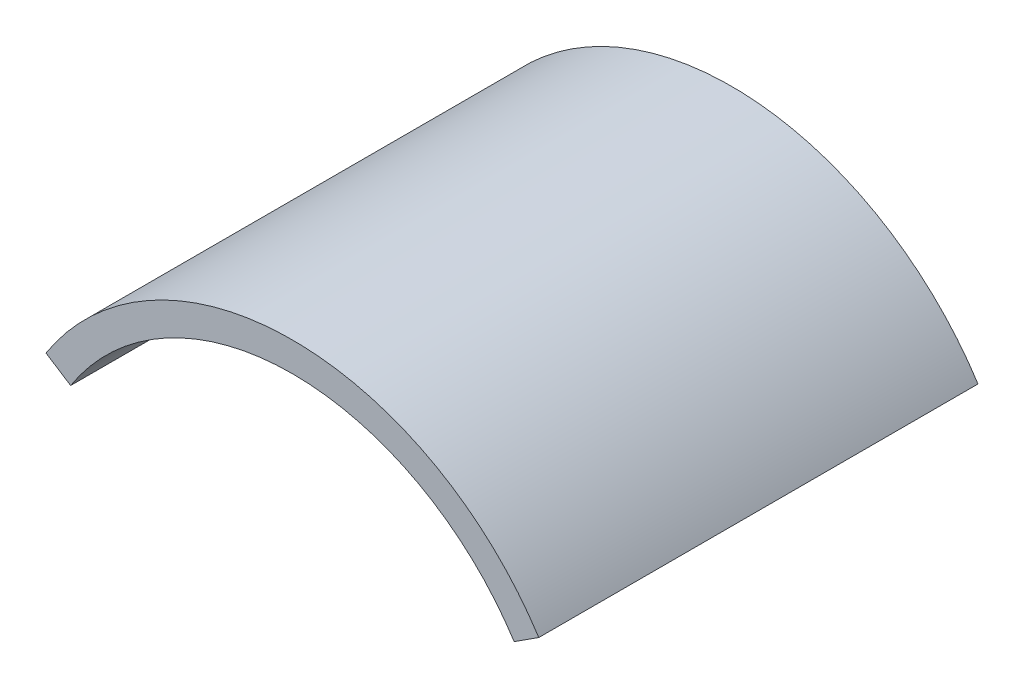
ISO-10303-21;
HEADER;
FILE_DESCRIPTION(('STEP AP214'),'2;1');
FILE_NAME('part.step','',(''),(''),'','','');
FILE_SCHEMA(('AUTOMOTIVE_DESIGN { 1 0 10303 214 1 1 1 1 }'));
ENDSEC;
DATA;
#1=APPLICATION_CONTEXT('core data for automotive mechanical design processes');
#2=APPLICATION_PROTOCOL_DEFINITION('international standard','automotive_design',2000,#1);
#3=PRODUCT_CONTEXT('',#1,'mechanical');
#4=PRODUCT('Part','Part','',(#3));
#5=PRODUCT_RELATED_PRODUCT_CATEGORY('part','',(#4));
#6=PRODUCT_DEFINITION_FORMATION('','',#4);
#7=PRODUCT_DEFINITION_CONTEXT('part definition',#1,'design');
#8=PRODUCT_DEFINITION('design','',#6,#7);
#9=PRODUCT_DEFINITION_SHAPE('','',#8);
#10=(LENGTH_UNIT() NAMED_UNIT(*) SI_UNIT(.MILLI.,.METRE.));
#11=(NAMED_UNIT(*) PLANE_ANGLE_UNIT() SI_UNIT($,.RADIAN.));
#12=(NAMED_UNIT(*) SI_UNIT($,.STERADIAN.) SOLID_ANGLE_UNIT());
#13=UNCERTAINTY_MEASURE_WITH_UNIT(LENGTH_MEASURE(1.E-05),#10,'distance_accuracy_value','');
#14=(GEOMETRIC_REPRESENTATION_CONTEXT(3) GLOBAL_UNCERTAINTY_ASSIGNED_CONTEXT((#13)) GLOBAL_UNIT_ASSIGNED_CONTEXT((#10,
#11,#12)) REPRESENTATION_CONTEXT('',''));
#15=CARTESIAN_POINT('',(0.,0.,0.));
#16=DIRECTION('',(0.,0.,1.));
#17=DIRECTION('',(1.,0.,0.));
#18=AXIS2_PLACEMENT_3D('',#15,#16,#17);
#19=CARTESIAN_POINT('',(0.,0.,0.));
#20=DIRECTION('',(0.,0.,1.));
#21=DIRECTION('',(1.,0.,0.));
#22=AXIS2_PLACEMENT_3D('',#19,#20,#21);
#23=PLANE('',#22);
#24=CARTESIAN_POINT('',(0.,0.,0.));
#25=DIRECTION('',(0.,0.,-1.));
#26=DIRECTION('',(1.,0.,0.));
#27=AXIS2_PLACEMENT_3D('',#24,#25,#26);
#28=CIRCLE('',#27,18.);
#29=CARTESIAN_POINT('',(-15.1463454098294,9.72564757361383,0.));
#30=VERTEX_POINT('',#29);
#31=CARTESIAN_POINT('',(15.1463454098294,9.72564757361383,0.));
#32=VERTEX_POINT('',#31);
#33=EDGE_CURVE('E72',#30,#32,#28,.T.);
#34=ORIENTED_EDGE('',*,*,#33,.T.);
#35=DIRECTION('',(0.84146363387941,0.540313754089657,0.));
#36=VECTOR('',#35,1.);
#37=CARTESIAN_POINT('',(15.1463454098294,9.72564757361383,0.));
#38=LINE('',#37,#36);
#39=CARTESIAN_POINT('',(16.8292726775882,10.8062750817931,0.));
#40=VERTEX_POINT('',#39);
#41=EDGE_CURVE('E67',#32,#40,#38,.T.);
#42=ORIENTED_EDGE('',*,*,#41,.T.);
#43=CARTESIAN_POINT('',(0.,0.,0.));
#44=DIRECTION('',(0.,0.,1.));
#45=DIRECTION('',(1.,0.,0.));
#46=AXIS2_PLACEMENT_3D('',#43,#44,#45);
#47=CIRCLE('',#46,20.);
#48=CARTESIAN_POINT('',(-16.8292726775882,10.8062750817931,0.));
#49=VERTEX_POINT('',#48);
#50=EDGE_CURVE('E84',#40,#49,#47,.T.);
#51=ORIENTED_EDGE('',*,*,#50,.T.);
#52=DIRECTION('',(0.841463633879411,-0.540313754089656,0.));
#53=VECTOR('',#52,1.);
#54=CARTESIAN_POINT('',(-16.8292726775882,10.8062750817931,0.));
#55=LINE('',#54,#53);
#56=EDGE_CURVE('E77',#49,#30,#55,.T.);
#57=ORIENTED_EDGE('',*,*,#56,.T.);
#58=EDGE_LOOP('',(#34,#42,#51,#57));
#59=FACE_BOUND('',#58,.T.);
#60=ADVANCED_FACE('F32',(#59),#23,.T.);
#61=CARTESIAN_POINT('',(0.,0.,-30.));
#62=DIRECTION('',(0.,0.,1.));
#63=DIRECTION('',(1.,0.,0.));
#64=AXIS2_PLACEMENT_3D('',#61,#62,#63);
#65=PLANE('',#64);
#66=CARTESIAN_POINT('',(0.,0.,-30.));
#67=DIRECTION('',(0.,0.,-1.));
#68=DIRECTION('',(1.,0.,0.));
#69=AXIS2_PLACEMENT_3D('',#66,#67,#68);
#70=CIRCLE('',#69,18.);
#71=CARTESIAN_POINT('',(-15.1463454098294,9.72564757361383,-30.));
#72=VERTEX_POINT('',#71);
#73=CARTESIAN_POINT('',(15.1463454098294,9.72564757361383,-30.));
#74=VERTEX_POINT('',#73);
#75=EDGE_CURVE('E46',#72,#74,#70,.T.);
#76=ORIENTED_EDGE('',*,*,#75,.F.);
#77=DIRECTION('',(0.841463633879411,-0.540313754089656,0.));
#78=VECTOR('',#77,1.);
#79=CARTESIAN_POINT('',(-16.8292726775882,10.8062750817931,-30.));
#80=LINE('',#79,#78);
#81=CARTESIAN_POINT('',(-16.8292726775882,10.8062750817931,-30.));
#82=VERTEX_POINT('',#81);
#83=EDGE_CURVE('E55',#82,#72,#80,.T.);
#84=ORIENTED_EDGE('',*,*,#83,.F.);
#85=CARTESIAN_POINT('',(0.,0.,-30.));
#86=DIRECTION('',(0.,0.,1.));
#87=DIRECTION('',(1.,0.,0.));
#88=AXIS2_PLACEMENT_3D('',#85,#86,#87);
#89=CIRCLE('',#88,20.);
#90=CARTESIAN_POINT('',(16.8292726775882,10.8062750817931,-30.));
#91=VERTEX_POINT('',#90);
#92=EDGE_CURVE('E92',#91,#82,#89,.T.);
#93=ORIENTED_EDGE('',*,*,#92,.F.);
#94=DIRECTION('',(0.84146363387941,0.540313754089657,0.));
#95=VECTOR('',#94,1.);
#96=CARTESIAN_POINT('',(15.1463454098294,9.72564757361383,-30.));
#97=LINE('',#96,#95);
#98=EDGE_CURVE('E11',#74,#91,#97,.T.);
#99=ORIENTED_EDGE('',*,*,#98,.F.);
#100=EDGE_LOOP('',(#76,#84,#93,#99));
#101=FACE_BOUND('',#100,.T.);
#102=ADVANCED_FACE('F114',(#101),#65,.F.);
#103=CARTESIAN_POINT('',(0.,0.,0.));
#104=DIRECTION('',(0.,0.,-1.));
#105=DIRECTION('',(-1.,0.,0.));
#106=AXIS2_PLACEMENT_3D('',#103,#104,#105);
#107=CYLINDRICAL_SURFACE('',#106,20.);
#108=DIRECTION('',(0.,0.,-1.));
#109=VECTOR('',#108,1.);
#110=CARTESIAN_POINT('',(-16.8292726775882,10.8062750817931,0.));
#111=LINE('',#110,#109);
#112=EDGE_CURVE('E87',#49,#82,#111,.T.);
#113=ORIENTED_EDGE('',*,*,#112,.F.);
#114=ORIENTED_EDGE('',*,*,#50,.F.);
#115=DIRECTION('',(0.,0.,-1.));
#116=VECTOR('',#115,1.);
#117=CARTESIAN_POINT('',(16.8292726775882,10.8062750817931,0.));
#118=LINE('',#117,#116);
#119=EDGE_CURVE('E86',#40,#91,#118,.T.);
#120=ORIENTED_EDGE('',*,*,#119,.T.);
#121=ORIENTED_EDGE('',*,*,#92,.T.);
#122=EDGE_LOOP('',(#113,#114,#120,#121));
#123=FACE_BOUND('',#122,.T.);
#124=ADVANCED_FACE('F85',(#123),#107,.T.);
#125=CARTESIAN_POINT('',(-16.8292726775882,10.8062750817931,0.));
#126=DIRECTION('',(0.540313754089656,0.841463633879411,0.));
#127=DIRECTION('',(-0.841463633879411,0.540313754089656,0.));
#128=AXIS2_PLACEMENT_3D('',#125,#126,#127);
#129=PLANE('',#128);
#130=DIRECTION('',(0.,0.,-1.));
#131=VECTOR('',#130,1.);
#132=CARTESIAN_POINT('',(-15.1463454098294,9.72564757361383,0.));
#133=LINE('',#132,#131);
#134=EDGE_CURVE('E99',#30,#72,#133,.T.);
#135=ORIENTED_EDGE('',*,*,#134,.F.);
#136=ORIENTED_EDGE('',*,*,#56,.F.);
#137=ORIENTED_EDGE('',*,*,#112,.T.);
#138=ORIENTED_EDGE('',*,*,#83,.T.);
#139=EDGE_LOOP('',(#135,#136,#137,#138));
#140=FACE_BOUND('',#139,.T.);
#141=ADVANCED_FACE('F105',(#140),#129,.F.);
#142=CARTESIAN_POINT('',(0.,0.,0.));
#143=DIRECTION('',(0.,0.,-1.));
#144=DIRECTION('',(-1.,0.,0.));
#145=AXIS2_PLACEMENT_3D('',#142,#143,#144);
#146=CYLINDRICAL_SURFACE('',#145,18.);
#147=DIRECTION('',(0.,0.,-1.));
#148=VECTOR('',#147,1.);
#149=CARTESIAN_POINT('',(15.1463454098294,9.72564757361383,0.));
#150=LINE('',#149,#148);
#151=EDGE_CURVE('E39',#32,#74,#150,.T.);
#152=ORIENTED_EDGE('',*,*,#151,.F.);
#153=ORIENTED_EDGE('',*,*,#33,.F.);
#154=ORIENTED_EDGE('',*,*,#134,.T.);
#155=ORIENTED_EDGE('',*,*,#75,.T.);
#156=EDGE_LOOP('',(#152,#153,#154,#155));
#157=FACE_BOUND('',#156,.T.);
#158=ADVANCED_FACE('F103',(#157),#146,.F.);
#159=CARTESIAN_POINT('',(15.1463454098294,9.72564757361383,0.));
#160=DIRECTION('',(-0.540313754089657,0.84146363387941,0.));
#161=DIRECTION('',(-0.84146363387941,-0.540313754089657,0.));
#162=AXIS2_PLACEMENT_3D('',#159,#160,#161);
#163=PLANE('',#162);
#164=ORIENTED_EDGE('',*,*,#98,.T.);
#165=ORIENTED_EDGE('',*,*,#119,.F.);
#166=ORIENTED_EDGE('',*,*,#41,.F.);
#167=ORIENTED_EDGE('',*,*,#151,.T.);
#168=EDGE_LOOP('',(#164,#165,#166,#167));
#169=FACE_BOUND('',#168,.T.);
#170=ADVANCED_FACE('F90',(#169),#163,.F.);
#171=CLOSED_SHELL('',(#60,#102,#124,#141,#158,#170));
#172=MANIFOLD_SOLID_BREP('B2',#171);
#173=ADVANCED_BREP_SHAPE_REPRESENTATION('',(#18,#172),#14);
#174=SHAPE_DEFINITION_REPRESENTATION(#9,#173);
ENDSEC;
END-ISO-10303-21;
